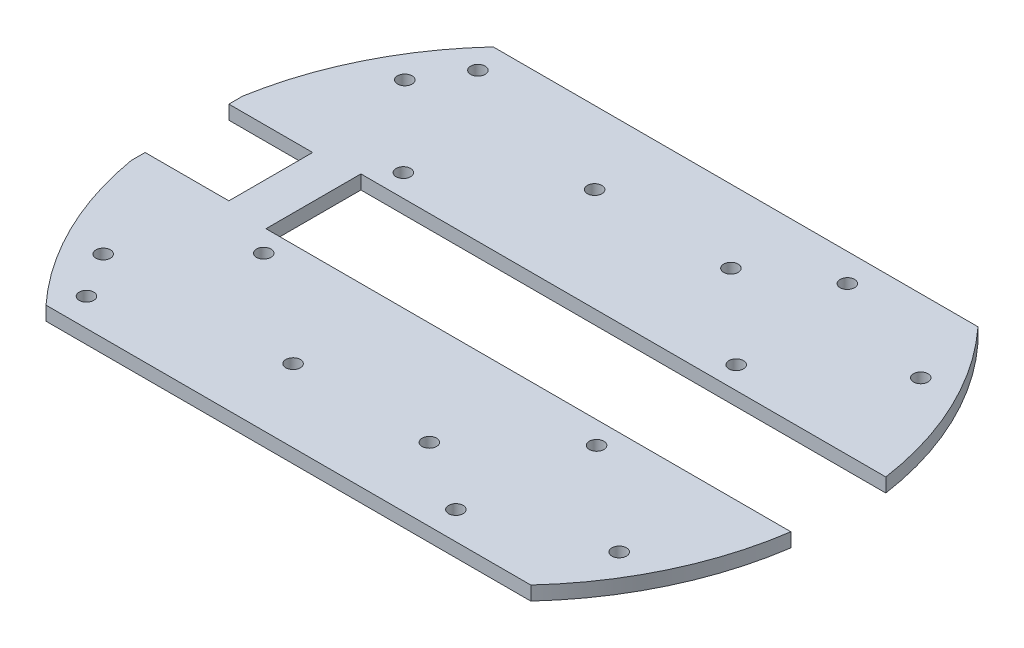
ISO-10303-21;
HEADER;
FILE_DESCRIPTION(('STEP AP214'),'2;1');
FILE_NAME('part.step','',(''),(''),'','','');
FILE_SCHEMA(('AUTOMOTIVE_DESIGN { 1 0 10303 214 1 1 1 1 }'));
ENDSEC;
DATA;
#1=APPLICATION_CONTEXT('core data for automotive mechanical design processes');
#2=APPLICATION_PROTOCOL_DEFINITION('international standard','automotive_design',2000,#1);
#3=PRODUCT_CONTEXT('',#1,'mechanical');
#4=PRODUCT('Part','Part','',(#3));
#5=PRODUCT_RELATED_PRODUCT_CATEGORY('part','',(#4));
#6=PRODUCT_DEFINITION_FORMATION('','',#4);
#7=PRODUCT_DEFINITION_CONTEXT('part definition',#1,'design');
#8=PRODUCT_DEFINITION('design','',#6,#7);
#9=PRODUCT_DEFINITION_SHAPE('','',#8);
#10=(LENGTH_UNIT() NAMED_UNIT(*) SI_UNIT(.MILLI.,.METRE.));
#11=(NAMED_UNIT(*) PLANE_ANGLE_UNIT() SI_UNIT($,.RADIAN.));
#12=(NAMED_UNIT(*) SI_UNIT($,.STERADIAN.) SOLID_ANGLE_UNIT());
#13=UNCERTAINTY_MEASURE_WITH_UNIT(LENGTH_MEASURE(1.E-05),#10,'distance_accuracy_value','');
#14=(GEOMETRIC_REPRESENTATION_CONTEXT(3) GLOBAL_UNCERTAINTY_ASSIGNED_CONTEXT((#13)) GLOBAL_UNIT_ASSIGNED_CONTEXT((#10,
#11,#12)) REPRESENTATION_CONTEXT('',''));
#15=CARTESIAN_POINT('',(0.,0.,0.));
#16=DIRECTION('',(0.,0.,1.));
#17=DIRECTION('',(1.,0.,0.));
#18=AXIS2_PLACEMENT_3D('',#15,#16,#17);
#19=CARTESIAN_POINT('',(-73.9169128143215,3.175,-12.7));
#20=DIRECTION('',(1.,0.,0.));
#21=DIRECTION('',(0.,0.,-1.));
#22=AXIS2_PLACEMENT_3D('',#19,#20,#21);
#23=PLANE('',#22);
#24=DIRECTION('',(0.,0.,1.));
#25=VECTOR('',#24,1.);
#26=CARTESIAN_POINT('',(-73.9169128143215,0.,-12.7));
#27=LINE('',#26,#25);
#28=CARTESIAN_POINT('',(-73.9169128143215,0.,-12.7));
#29=VERTEX_POINT('',#28);
#30=CARTESIAN_POINT('',(-73.9169128143215,0.,-9.525));
#31=VERTEX_POINT('',#30);
#32=EDGE_CURVE('E179',#29,#31,#27,.T.);
#33=ORIENTED_EDGE('',*,*,#32,.T.);
#34=DIRECTION('',(0.,1.,0.));
#35=VECTOR('',#34,1.);
#36=CARTESIAN_POINT('',(-73.9169128143215,-26.9407683632075,-9.525));
#37=LINE('',#36,#35);
#38=CARTESIAN_POINT('',(-73.9169128143215,3.175,-9.525));
#39=VERTEX_POINT('',#38);
#40=EDGE_CURVE('E337',#31,#39,#37,.T.);
#41=ORIENTED_EDGE('',*,*,#40,.T.);
#42=DIRECTION('',(0.,0.,1.));
#43=VECTOR('',#42,1.);
#44=CARTESIAN_POINT('',(-73.9169128143215,3.175,-12.7));
#45=LINE('',#44,#43);
#46=CARTESIAN_POINT('',(-73.9169128143215,3.175,-12.7));
#47=VERTEX_POINT('',#46);
#48=EDGE_CURVE('E155',#47,#39,#45,.T.);
#49=ORIENTED_EDGE('',*,*,#48,.F.);
#50=DIRECTION('',(0.,-1.,0.));
#51=VECTOR('',#50,1.);
#52=CARTESIAN_POINT('',(-73.9169128143215,3.175,-12.7));
#53=LINE('',#52,#51);
#54=EDGE_CURVE('E149',#47,#29,#53,.T.);
#55=ORIENTED_EDGE('',*,*,#54,.T.);
#56=EDGE_LOOP('',(#33,#41,#49,#55));
#57=FACE_BOUND('',#56,.T.);
#58=ADVANCED_FACE('F33',(#57),#23,.F.);
#59=CARTESIAN_POINT('',(0.,3.175,0.));
#60=DIRECTION('',(0.,1.,0.));
#61=DIRECTION('',(0.,0.,1.));
#62=AXIS2_PLACEMENT_3D('',#59,#60,#61);
#63=PLANE('',#62);
#64=DIRECTION('',(-1.,0.,0.));
#65=VECTOR('',#64,1.);
#66=CARTESIAN_POINT('',(-73.9169128143215,3.175,-9.525));
#67=LINE('',#66,#65);
#68=CARTESIAN_POINT('',(-54.8669128143215,3.175,-9.525));
#69=VERTEX_POINT('',#68);
#70=EDGE_CURVE('E331',#69,#39,#67,.T.);
#71=ORIENTED_EDGE('',*,*,#70,.F.);
#72=DIRECTION('',(0.,0.,-1.));
#73=VECTOR('',#72,1.);
#74=CARTESIAN_POINT('',(-54.8669128143215,3.175,-9.525));
#75=LINE('',#74,#73);
#76=CARTESIAN_POINT('',(-54.8669128143215,3.175,9.525));
#77=VERTEX_POINT('',#76);
#78=EDGE_CURVE('E343',#77,#69,#75,.T.);
#79=ORIENTED_EDGE('',*,*,#78,.F.);
#80=DIRECTION('',(1.,0.,0.));
#81=VECTOR('',#80,1.);
#82=CARTESIAN_POINT('',(-54.8669128143215,3.175,9.525));
#83=LINE('',#82,#81);
#84=CARTESIAN_POINT('',(-73.9169128143215,3.175,9.525));
#85=VERTEX_POINT('',#84);
#86=EDGE_CURVE('E346',#85,#77,#83,.T.);
#87=ORIENTED_EDGE('',*,*,#86,.F.);
#88=CARTESIAN_POINT('',(-73.9169128143215,3.175,12.7));
#89=VERTEX_POINT('',#88);
#90=EDGE_CURVE('E57',#85,#89,#45,.T.);
#91=ORIENTED_EDGE('',*,*,#90,.T.);
#92=CARTESIAN_POINT('',(0.,3.175,0.));
#93=DIRECTION('',(0.,1.,0.));
#94=DIRECTION('',(0.,0.,1.));
#95=AXIS2_PLACEMENT_3D('',#92,#93,#94);
#96=CIRCLE('',#95,75.);
#97=CARTESIAN_POINT('',(-55.1227591712517,3.175,50.8574618059944));
#98=VERTEX_POINT('',#97);
#99=EDGE_CURVE('E182',#89,#98,#96,.T.);
#100=ORIENTED_EDGE('',*,*,#99,.T.);
#101=DIRECTION('',(1.,0.,0.));
#102=VECTOR('',#101,1.);
#103=CARTESIAN_POINT('',(-55.1227591712517,3.175,50.8574618059944));
#104=LINE('',#103,#102);
#105=CARTESIAN_POINT('',(55.1227591712517,3.175,50.8574618059944));
#106=VERTEX_POINT('',#105);
#107=EDGE_CURVE('E104',#98,#106,#104,.T.);
#108=ORIENTED_EDGE('',*,*,#107,.T.);
#109=CARTESIAN_POINT('',(0.,3.175,0.));
#110=DIRECTION('',(0.,1.,0.));
#111=DIRECTION('',(0.,0.,1.));
#112=AXIS2_PLACEMENT_3D('',#109,#110,#111);
#113=CIRCLE('',#112,75.);
#114=CARTESIAN_POINT('',(74.2190539888511,3.175,10.795));
#115=VERTEX_POINT('',#114);
#116=EDGE_CURVE('E203',#106,#115,#113,.T.);
#117=ORIENTED_EDGE('',*,*,#116,.T.);
#118=DIRECTION('',(-1.,0.,0.));
#119=VECTOR('',#118,1.);
#120=CARTESIAN_POINT('',(74.2190539888511,3.175,10.795));
#121=LINE('',#120,#119);
#122=CARTESIAN_POINT('',(-45.1587340920467,3.175,10.795));
#123=VERTEX_POINT('',#122);
#124=EDGE_CURVE('E223',#115,#123,#121,.T.);
#125=ORIENTED_EDGE('',*,*,#124,.T.);
#126=DIRECTION('',(0.,0.,-1.));
#127=VECTOR('',#126,1.);
#128=CARTESIAN_POINT('',(-45.1587340920467,3.175,-10.795));
#129=LINE('',#128,#127);
#130=CARTESIAN_POINT('',(-45.1587340920467,3.175,-10.795));
#131=VERTEX_POINT('',#130);
#132=EDGE_CURVE('E220',#123,#131,#129,.T.);
#133=ORIENTED_EDGE('',*,*,#132,.T.);
#134=DIRECTION('',(1.,0.,0.));
#135=VECTOR('',#134,1.);
#136=CARTESIAN_POINT('',(74.2190539888511,3.175,-10.795));
#137=LINE('',#136,#135);
#138=CARTESIAN_POINT('',(74.2190539888511,3.175,-10.795));
#139=VERTEX_POINT('',#138);
#140=EDGE_CURVE('E222',#131,#139,#137,.T.);
#141=ORIENTED_EDGE('',*,*,#140,.T.);
#142=CARTESIAN_POINT('',(0.,3.175,0.));
#143=DIRECTION('',(0.,1.,0.));
#144=DIRECTION('',(0.,0.,1.));
#145=AXIS2_PLACEMENT_3D('',#142,#143,#144);
#146=CIRCLE('',#145,75.);
#147=CARTESIAN_POINT('',(55.1227591712517,3.175,-50.8574618059944));
#148=VERTEX_POINT('',#147);
#149=EDGE_CURVE('E136',#139,#148,#146,.T.);
#150=ORIENTED_EDGE('',*,*,#149,.T.);
#151=DIRECTION('',(-1.,0.,0.));
#152=VECTOR('',#151,1.);
#153=CARTESIAN_POINT('',(-55.1227591712517,3.175,-50.8574618059944));
#154=LINE('',#153,#152);
#155=CARTESIAN_POINT('',(-55.1227591712517,3.175,-50.8574618059944));
#156=VERTEX_POINT('',#155);
#157=EDGE_CURVE('E126',#148,#156,#154,.T.);
#158=ORIENTED_EDGE('',*,*,#157,.T.);
#159=CARTESIAN_POINT('',(0.,3.175,0.));
#160=DIRECTION('',(0.,1.,0.));
#161=DIRECTION('',(0.,0.,1.));
#162=AXIS2_PLACEMENT_3D('',#159,#160,#161);
#163=CIRCLE('',#162,75.);
#164=EDGE_CURVE('E133',#156,#47,#163,.T.);
#165=ORIENTED_EDGE('',*,*,#164,.T.);
#166=ORIENTED_EDGE('',*,*,#48,.T.);
#167=EDGE_LOOP('',(#71,#79,#87,#91,#100,#108,#117,#125,#133,#141,#150,#158,#165,#166));
#168=FACE_BOUND('',#167,.T.);
#169=CARTESIAN_POINT('',(58.6769128143214,3.175,-34.2899999999999));
#170=DIRECTION('',(0.,1.,0.));
#171=DIRECTION('',(0.,0.,-1.));
#172=AXIS2_PLACEMENT_3D('',#169,#170,#171);
#173=CIRCLE('',#172,1.651);
#174=CARTESIAN_POINT('',(58.6769128143214,3.175,-35.9409999999999));
#175=VERTEX_POINT('',#174);
#176=EDGE_CURVE('E312',#175,#175,#173,.T.);
#177=ORIENTED_EDGE('',*,*,#176,.F.);
#178=EDGE_LOOP('',(#177));
#179=FACE_BOUND('',#178,.T.);
#180=CARTESIAN_POINT('',(15.4969128143214,3.175,34.2899999999999));
#181=DIRECTION('',(0.,1.,0.));
#182=DIRECTION('',(0.,0.,-1.));
#183=AXIS2_PLACEMENT_3D('',#180,#181,#182);
#184=CIRCLE('',#183,1.651);
#185=CARTESIAN_POINT('',(15.4969128143214,3.175,32.6389999999999));
#186=VERTEX_POINT('',#185);
#187=EDGE_CURVE('E300',#186,#186,#184,.T.);
#188=ORIENTED_EDGE('',*,*,#187,.F.);
#189=EDGE_LOOP('',(#188));
#190=FACE_BOUND('',#189,.T.);
#191=CARTESIAN_POINT('',(-15.4969128143214,3.175,34.29));
#192=DIRECTION('',(0.,1.,0.));
#193=DIRECTION('',(0.,0.,1.));
#194=AXIS2_PLACEMENT_3D('',#191,#192,#193);
#195=CIRCLE('',#194,1.651);
#196=CARTESIAN_POINT('',(-15.4969128143214,3.175,35.941));
#197=VERTEX_POINT('',#196);
#198=EDGE_CURVE('E288',#197,#197,#195,.T.);
#199=ORIENTED_EDGE('',*,*,#198,.F.);
#200=EDGE_LOOP('',(#199));
#201=FACE_BOUND('',#200,.T.);
#202=CARTESIAN_POINT('',(-58.6769128143214,3.175,-34.2899999999999));
#203=DIRECTION('',(0.,1.,0.));
#204=DIRECTION('',(0.,0.,1.));
#205=AXIS2_PLACEMENT_3D('',#202,#203,#204);
#206=CIRCLE('',#205,1.651);
#207=CARTESIAN_POINT('',(-58.6769128143214,3.175,-32.6389999999999));
#208=VERTEX_POINT('',#207);
#209=EDGE_CURVE('E276',#208,#208,#206,.T.);
#210=ORIENTED_EDGE('',*,*,#209,.F.);
#211=EDGE_LOOP('',(#210));
#212=FACE_BOUND('',#211,.T.);
#213=CARTESIAN_POINT('',(-52.2676605903492,3.175,44.5074618059944));
#214=DIRECTION('',(0.,1.,0.));
#215=DIRECTION('',(0.,0.,1.));
#216=AXIS2_PLACEMENT_3D('',#213,#214,#215);
#217=CIRCLE('',#216,1.651);
#218=CARTESIAN_POINT('',(-52.2676605903492,3.175,46.1584618059944));
#219=VERTEX_POINT('',#218);
#220=EDGE_CURVE('E264',#219,#219,#217,.T.);
#221=ORIENTED_EDGE('',*,*,#220,.F.);
#222=EDGE_LOOP('',(#221));
#223=FACE_BOUND('',#222,.T.);
#224=CARTESIAN_POINT('',(31.75,3.175,-44.5074618059944));
#225=DIRECTION('',(0.,1.,0.));
#226=DIRECTION('',(0.,0.,1.));
#227=AXIS2_PLACEMENT_3D('',#224,#225,#226);
#228=CIRCLE('',#227,1.651);
#229=CARTESIAN_POINT('',(31.75,3.175,-42.8564618059944));
#230=VERTEX_POINT('',#229);
#231=EDGE_CURVE('E252',#230,#230,#228,.T.);
#232=ORIENTED_EDGE('',*,*,#231,.F.);
#233=EDGE_LOOP('',(#232));
#234=FACE_BOUND('',#233,.T.);
#235=CARTESIAN_POINT('',(-40.5944268326438,3.175,15.875));
#236=DIRECTION('',(0.,1.,0.));
#237=DIRECTION('',(0.,0.,1.));
#238=AXIS2_PLACEMENT_3D('',#235,#236,#237);
#239=CIRCLE('',#238,1.65099999999997);
#240=CARTESIAN_POINT('',(-40.5944268326438,3.175,17.526));
#241=VERTEX_POINT('',#240);
#242=EDGE_CURVE('E240',#241,#241,#239,.T.);
#243=ORIENTED_EDGE('',*,*,#242,.F.);
#244=EDGE_LOOP('',(#243));
#245=FACE_BOUND('',#244,.T.);
#246=CARTESIAN_POINT('',(35.1052659079533,3.175,-15.875));
#247=DIRECTION('',(0.,1.,0.));
#248=DIRECTION('',(0.,0.,1.));
#249=AXIS2_PLACEMENT_3D('',#246,#247,#248);
#250=CIRCLE('',#249,1.65099999999997);
#251=CARTESIAN_POINT('',(35.1052659079533,3.175,-14.224));
#252=VERTEX_POINT('',#251);
#253=EDGE_CURVE('E164',#252,#252,#250,.T.);
#254=ORIENTED_EDGE('',*,*,#253,.F.);
#255=EDGE_LOOP('',(#254));
#256=FACE_BOUND('',#255,.T.);
#257=CARTESIAN_POINT('',(35.1052659079533,3.175,15.875));
#258=DIRECTION('',(0.,1.,0.));
#259=DIRECTION('',(0.,0.,1.));
#260=AXIS2_PLACEMENT_3D('',#257,#258,#259);
#261=CIRCLE('',#260,1.65099999999997);
#262=CARTESIAN_POINT('',(35.1052659079533,3.175,17.526));
#263=VERTEX_POINT('',#262);
#264=EDGE_CURVE('E234',#263,#263,#261,.T.);
#265=ORIENTED_EDGE('',*,*,#264,.F.);
#266=EDGE_LOOP('',(#265));
#267=FACE_BOUND('',#266,.T.);
#268=CARTESIAN_POINT('',(-40.5944268326438,3.175,-15.875));
#269=DIRECTION('',(0.,1.,0.));
#270=DIRECTION('',(0.,0.,1.));
#271=AXIS2_PLACEMENT_3D('',#268,#269,#270);
#272=CIRCLE('',#271,1.65099999999997);
#273=CARTESIAN_POINT('',(-40.5944268326438,3.175,-14.224));
#274=VERTEX_POINT('',#273);
#275=EDGE_CURVE('E246',#274,#274,#272,.T.);
#276=ORIENTED_EDGE('',*,*,#275,.F.);
#277=EDGE_LOOP('',(#276));
#278=FACE_BOUND('',#277,.T.);
#279=CARTESIAN_POINT('',(31.75,3.175,44.5074618059944));
#280=DIRECTION('',(0.,1.,0.));
#281=DIRECTION('',(0.,0.,1.));
#282=AXIS2_PLACEMENT_3D('',#279,#280,#281);
#283=CIRCLE('',#282,1.651);
#284=CARTESIAN_POINT('',(31.75,3.175,46.1584618059944));
#285=VERTEX_POINT('',#284);
#286=EDGE_CURVE('E258',#285,#285,#283,.T.);
#287=ORIENTED_EDGE('',*,*,#286,.F.);
#288=EDGE_LOOP('',(#287));
#289=FACE_BOUND('',#288,.T.);
#290=CARTESIAN_POINT('',(-52.2676605903492,3.175,-44.5074618059944));
#291=DIRECTION('',(0.,1.,0.));
#292=DIRECTION('',(0.,0.,1.));
#293=AXIS2_PLACEMENT_3D('',#290,#291,#292);
#294=CIRCLE('',#293,1.651);
#295=CARTESIAN_POINT('',(-52.2676605903492,3.175,-42.8564618059944));
#296=VERTEX_POINT('',#295);
#297=EDGE_CURVE('E270',#296,#296,#294,.T.);
#298=ORIENTED_EDGE('',*,*,#297,.F.);
#299=EDGE_LOOP('',(#298));
#300=FACE_BOUND('',#299,.T.);
#301=CARTESIAN_POINT('',(-15.4969128143214,3.175,-34.2899999999999));
#302=DIRECTION('',(0.,1.,0.));
#303=DIRECTION('',(0.,0.,1.));
#304=AXIS2_PLACEMENT_3D('',#301,#302,#303);
#305=CIRCLE('',#304,1.651);
#306=CARTESIAN_POINT('',(-15.4969128143214,3.175,-32.6389999999999));
#307=VERTEX_POINT('',#306);
#308=EDGE_CURVE('E282',#307,#307,#305,.T.);
#309=ORIENTED_EDGE('',*,*,#308,.F.);
#310=EDGE_LOOP('',(#309));
#311=FACE_BOUND('',#310,.T.);
#312=CARTESIAN_POINT('',(-58.6769128143214,3.175,34.29));
#313=DIRECTION('',(0.,1.,0.));
#314=DIRECTION('',(0.,0.,1.));
#315=AXIS2_PLACEMENT_3D('',#312,#313,#314);
#316=CIRCLE('',#315,1.651);
#317=CARTESIAN_POINT('',(-58.6769128143214,3.175,35.941));
#318=VERTEX_POINT('',#317);
#319=EDGE_CURVE('E294',#318,#318,#316,.T.);
#320=ORIENTED_EDGE('',*,*,#319,.F.);
#321=EDGE_LOOP('',(#320));
#322=FACE_BOUND('',#321,.T.);
#323=CARTESIAN_POINT('',(58.6769128143214,3.175,34.2899999999999));
#324=DIRECTION('',(0.,1.,0.));
#325=DIRECTION('',(0.,0.,-1.));
#326=AXIS2_PLACEMENT_3D('',#323,#324,#325);
#327=CIRCLE('',#326,1.651);
#328=CARTESIAN_POINT('',(58.6769128143214,3.175,32.6389999999999));
#329=VERTEX_POINT('',#328);
#330=EDGE_CURVE('E306',#329,#329,#327,.T.);
#331=ORIENTED_EDGE('',*,*,#330,.F.);
#332=EDGE_LOOP('',(#331));
#333=FACE_BOUND('',#332,.T.);
#334=CARTESIAN_POINT('',(15.4969128143214,3.175,-34.2899999999999));
#335=DIRECTION('',(0.,1.,0.));
#336=DIRECTION('',(0.,0.,-1.));
#337=AXIS2_PLACEMENT_3D('',#334,#335,#336);
#338=CIRCLE('',#337,1.651);
#339=CARTESIAN_POINT('',(15.4969128143214,3.175,-35.941));
#340=VERTEX_POINT('',#339);
#341=EDGE_CURVE('E318',#340,#340,#338,.T.);
#342=ORIENTED_EDGE('',*,*,#341,.F.);
#343=EDGE_LOOP('',(#342));
#344=FACE_BOUND('',#343,.T.);
#345=ADVANCED_FACE('F129',(#168,#179,#190,#201,#212,#223,#234,#245,#256,#267,#278,#289,#300,
#311,#322,#333,#344),#63,.T.);
#346=CARTESIAN_POINT('',(0.,0.,0.));
#347=DIRECTION('',(0.,1.,0.));
#348=DIRECTION('',(0.,0.,1.));
#349=AXIS2_PLACEMENT_3D('',#346,#347,#348);
#350=PLANE('',#349);
#351=CARTESIAN_POINT('',(58.6769128143214,0.,-34.2899999999999));
#352=DIRECTION('',(0.,1.,0.));
#353=DIRECTION('',(0.,0.,-1.));
#354=AXIS2_PLACEMENT_3D('',#351,#352,#353);
#355=CIRCLE('',#354,1.651);
#356=CARTESIAN_POINT('',(58.6769128143214,0.,-35.9409999999999));
#357=VERTEX_POINT('',#356);
#358=EDGE_CURVE('E315',#357,#357,#355,.T.);
#359=ORIENTED_EDGE('',*,*,#358,.T.);
#360=EDGE_LOOP('',(#359));
#361=FACE_BOUND('',#360,.T.);
#362=CARTESIAN_POINT('',(15.4969128143214,0.,34.2899999999999));
#363=DIRECTION('',(0.,1.,0.));
#364=DIRECTION('',(0.,0.,-1.));
#365=AXIS2_PLACEMENT_3D('',#362,#363,#364);
#366=CIRCLE('',#365,1.651);
#367=CARTESIAN_POINT('',(15.4969128143214,0.,32.6389999999999));
#368=VERTEX_POINT('',#367);
#369=EDGE_CURVE('E303',#368,#368,#366,.T.);
#370=ORIENTED_EDGE('',*,*,#369,.T.);
#371=EDGE_LOOP('',(#370));
#372=FACE_BOUND('',#371,.T.);
#373=CARTESIAN_POINT('',(-15.4969128143214,0.,34.29));
#374=DIRECTION('',(0.,1.,0.));
#375=DIRECTION('',(0.,0.,1.));
#376=AXIS2_PLACEMENT_3D('',#373,#374,#375);
#377=CIRCLE('',#376,1.651);
#378=CARTESIAN_POINT('',(-15.4969128143214,0.,35.941));
#379=VERTEX_POINT('',#378);
#380=EDGE_CURVE('E291',#379,#379,#377,.T.);
#381=ORIENTED_EDGE('',*,*,#380,.T.);
#382=EDGE_LOOP('',(#381));
#383=FACE_BOUND('',#382,.T.);
#384=CARTESIAN_POINT('',(-58.6769128143214,0.,-34.2899999999999));
#385=DIRECTION('',(0.,1.,0.));
#386=DIRECTION('',(0.,0.,1.));
#387=AXIS2_PLACEMENT_3D('',#384,#385,#386);
#388=CIRCLE('',#387,1.651);
#389=CARTESIAN_POINT('',(-58.6769128143214,0.,-32.6389999999999));
#390=VERTEX_POINT('',#389);
#391=EDGE_CURVE('E279',#390,#390,#388,.T.);
#392=ORIENTED_EDGE('',*,*,#391,.T.);
#393=EDGE_LOOP('',(#392));
#394=FACE_BOUND('',#393,.T.);
#395=CARTESIAN_POINT('',(-52.2676605903492,0.,44.5074618059944));
#396=DIRECTION('',(0.,1.,0.));
#397=DIRECTION('',(0.,0.,1.));
#398=AXIS2_PLACEMENT_3D('',#395,#396,#397);
#399=CIRCLE('',#398,1.651);
#400=CARTESIAN_POINT('',(-52.2676605903492,0.,46.1584618059944));
#401=VERTEX_POINT('',#400);
#402=EDGE_CURVE('E267',#401,#401,#399,.T.);
#403=ORIENTED_EDGE('',*,*,#402,.T.);
#404=EDGE_LOOP('',(#403));
#405=FACE_BOUND('',#404,.T.);
#406=CARTESIAN_POINT('',(31.75,0.,-44.5074618059944));
#407=DIRECTION('',(0.,1.,0.));
#408=DIRECTION('',(0.,0.,1.));
#409=AXIS2_PLACEMENT_3D('',#406,#407,#408);
#410=CIRCLE('',#409,1.651);
#411=CARTESIAN_POINT('',(31.75,0.,-42.8564618059944));
#412=VERTEX_POINT('',#411);
#413=EDGE_CURVE('E255',#412,#412,#410,.T.);
#414=ORIENTED_EDGE('',*,*,#413,.T.);
#415=EDGE_LOOP('',(#414));
#416=FACE_BOUND('',#415,.T.);
#417=CARTESIAN_POINT('',(-40.5944268326438,0.,15.875));
#418=DIRECTION('',(0.,1.,0.));
#419=DIRECTION('',(0.,0.,1.));
#420=AXIS2_PLACEMENT_3D('',#417,#418,#419);
#421=CIRCLE('',#420,1.65099999999997);
#422=CARTESIAN_POINT('',(-40.5944268326438,0.,17.526));
#423=VERTEX_POINT('',#422);
#424=EDGE_CURVE('E243',#423,#423,#421,.T.);
#425=ORIENTED_EDGE('',*,*,#424,.T.);
#426=EDGE_LOOP('',(#425));
#427=FACE_BOUND('',#426,.T.);
#428=CARTESIAN_POINT('',(35.1052659079533,0.,-15.875));
#429=DIRECTION('',(0.,1.,0.));
#430=DIRECTION('',(0.,0.,1.));
#431=AXIS2_PLACEMENT_3D('',#428,#429,#430);
#432=CIRCLE('',#431,1.65099999999997);
#433=CARTESIAN_POINT('',(35.1052659079533,0.,-14.224));
#434=VERTEX_POINT('',#433);
#435=EDGE_CURVE('E231',#434,#434,#432,.T.);
#436=ORIENTED_EDGE('',*,*,#435,.T.);
#437=EDGE_LOOP('',(#436));
#438=FACE_BOUND('',#437,.T.);
#439=DIRECTION('',(0.,0.,1.));
#440=VECTOR('',#439,1.);
#441=CARTESIAN_POINT('',(-54.8669128143215,0.,-9.525));
#442=LINE('',#441,#440);
#443=CARTESIAN_POINT('',(-54.8669128143215,0.,-9.525));
#444=VERTEX_POINT('',#443);
#445=CARTESIAN_POINT('',(-54.8669128143215,0.,9.525));
#446=VERTEX_POINT('',#445);
#447=EDGE_CURVE('E340',#444,#446,#442,.T.);
#448=ORIENTED_EDGE('',*,*,#447,.F.);
#449=DIRECTION('',(1.,0.,0.));
#450=VECTOR('',#449,1.);
#451=CARTESIAN_POINT('',(-73.9169128143215,0.,-9.525));
#452=LINE('',#451,#450);
#453=EDGE_CURVE('E327',#31,#444,#452,.T.);
#454=ORIENTED_EDGE('',*,*,#453,.F.);
#455=ORIENTED_EDGE('',*,*,#32,.F.);
#456=CARTESIAN_POINT('',(0.,0.,0.));
#457=DIRECTION('',(0.,1.,0.));
#458=DIRECTION('',(0.,0.,1.));
#459=AXIS2_PLACEMENT_3D('',#456,#457,#458);
#460=CIRCLE('',#459,75.);
#461=CARTESIAN_POINT('',(-55.1227591712517,0.,-50.8574618059944));
#462=VERTEX_POINT('',#461);
#463=EDGE_CURVE('E177',#462,#29,#460,.T.);
#464=ORIENTED_EDGE('',*,*,#463,.F.);
#465=DIRECTION('',(-1.,0.,0.));
#466=VECTOR('',#465,1.);
#467=CARTESIAN_POINT('',(-55.1227591712517,0.,-50.8574618059944));
#468=LINE('',#467,#466);
#469=CARTESIAN_POINT('',(55.1227591712517,0.,-50.8574618059944));
#470=VERTEX_POINT('',#469);
#471=EDGE_CURVE('E145',#470,#462,#468,.T.);
#472=ORIENTED_EDGE('',*,*,#471,.F.);
#473=CARTESIAN_POINT('',(0.,0.,0.));
#474=DIRECTION('',(0.,1.,0.));
#475=DIRECTION('',(0.,0.,1.));
#476=AXIS2_PLACEMENT_3D('',#473,#474,#475);
#477=CIRCLE('',#476,75.);
#478=CARTESIAN_POINT('',(74.2190539888511,0.,-10.795));
#479=VERTEX_POINT('',#478);
#480=EDGE_CURVE('E174',#479,#470,#477,.T.);
#481=ORIENTED_EDGE('',*,*,#480,.F.);
#482=DIRECTION('',(1.,0.,0.));
#483=VECTOR('',#482,1.);
#484=CARTESIAN_POINT('',(74.2190539888511,0.,-10.795));
#485=LINE('',#484,#483);
#486=CARTESIAN_POINT('',(-45.1587340920467,0.,-10.795));
#487=VERTEX_POINT('',#486);
#488=EDGE_CURVE('E172',#487,#479,#485,.T.);
#489=ORIENTED_EDGE('',*,*,#488,.F.);
#490=DIRECTION('',(0.,0.,-1.));
#491=VECTOR('',#490,1.);
#492=CARTESIAN_POINT('',(-45.1587340920467,0.,-10.795));
#493=LINE('',#492,#491);
#494=CARTESIAN_POINT('',(-45.1587340920467,0.,10.795));
#495=VERTEX_POINT('',#494);
#496=EDGE_CURVE('E170',#495,#487,#493,.T.);
#497=ORIENTED_EDGE('',*,*,#496,.F.);
#498=DIRECTION('',(-1.,0.,0.));
#499=VECTOR('',#498,1.);
#500=CARTESIAN_POINT('',(74.2190539888511,0.,10.795));
#501=LINE('',#500,#499);
#502=CARTESIAN_POINT('',(74.2190539888511,0.,10.795));
#503=VERTEX_POINT('',#502);
#504=EDGE_CURVE('E168',#503,#495,#501,.T.);
#505=ORIENTED_EDGE('',*,*,#504,.F.);
#506=CARTESIAN_POINT('',(0.,0.,0.));
#507=DIRECTION('',(0.,1.,0.));
#508=DIRECTION('',(0.,0.,1.));
#509=AXIS2_PLACEMENT_3D('',#506,#507,#508);
#510=CIRCLE('',#509,75.);
#511=CARTESIAN_POINT('',(55.1227591712517,0.,50.8574618059944));
#512=VERTEX_POINT('',#511);
#513=EDGE_CURVE('E166',#512,#503,#510,.T.);
#514=ORIENTED_EDGE('',*,*,#513,.F.);
#515=DIRECTION('',(1.,0.,0.));
#516=VECTOR('',#515,1.);
#517=CARTESIAN_POINT('',(-55.1227591712517,0.,50.8574618059944));
#518=LINE('',#517,#516);
#519=CARTESIAN_POINT('',(-55.1227591712517,0.,50.8574618059944));
#520=VERTEX_POINT('',#519);
#521=EDGE_CURVE('E163',#520,#512,#518,.T.);
#522=ORIENTED_EDGE('',*,*,#521,.F.);
#523=CARTESIAN_POINT('',(0.,0.,0.));
#524=DIRECTION('',(0.,1.,0.));
#525=DIRECTION('',(0.,0.,1.));
#526=AXIS2_PLACEMENT_3D('',#523,#524,#525);
#527=CIRCLE('',#526,75.);
#528=CARTESIAN_POINT('',(-73.9169128143215,0.,12.7));
#529=VERTEX_POINT('',#528);
#530=EDGE_CURVE('E160',#529,#520,#527,.T.);
#531=ORIENTED_EDGE('',*,*,#530,.F.);
#532=CARTESIAN_POINT('',(-73.9169128143215,0.,9.525));
#533=VERTEX_POINT('',#532);
#534=EDGE_CURVE('E96',#533,#529,#27,.T.);
#535=ORIENTED_EDGE('',*,*,#534,.F.);
#536=DIRECTION('',(-1.,0.,0.));
#537=VECTOR('',#536,1.);
#538=CARTESIAN_POINT('',(-54.8669128143215,0.,9.525));
#539=LINE('',#538,#537);
#540=EDGE_CURVE('E48',#446,#533,#539,.T.);
#541=ORIENTED_EDGE('',*,*,#540,.F.);
#542=EDGE_LOOP('',(#448,#454,#455,#464,#472,#481,#489,#497,#505,#514,#522,#531,#535,#541));
#543=FACE_BOUND('',#542,.T.);
#544=CARTESIAN_POINT('',(35.1052659079533,0.,15.875));
#545=DIRECTION('',(0.,1.,0.));
#546=DIRECTION('',(0.,0.,1.));
#547=AXIS2_PLACEMENT_3D('',#544,#545,#546);
#548=CIRCLE('',#547,1.65099999999997);
#549=CARTESIAN_POINT('',(35.1052659079533,0.,17.526));
#550=VERTEX_POINT('',#549);
#551=EDGE_CURVE('E237',#550,#550,#548,.T.);
#552=ORIENTED_EDGE('',*,*,#551,.T.);
#553=EDGE_LOOP('',(#552));
#554=FACE_BOUND('',#553,.T.);
#555=CARTESIAN_POINT('',(-40.5944268326438,0.,-15.875));
#556=DIRECTION('',(0.,1.,0.));
#557=DIRECTION('',(0.,0.,1.));
#558=AXIS2_PLACEMENT_3D('',#555,#556,#557);
#559=CIRCLE('',#558,1.65099999999997);
#560=CARTESIAN_POINT('',(-40.5944268326438,0.,-14.224));
#561=VERTEX_POINT('',#560);
#562=EDGE_CURVE('E249',#561,#561,#559,.T.);
#563=ORIENTED_EDGE('',*,*,#562,.T.);
#564=EDGE_LOOP('',(#563));
#565=FACE_BOUND('',#564,.T.);
#566=CARTESIAN_POINT('',(31.75,0.,44.5074618059944));
#567=DIRECTION('',(0.,1.,0.));
#568=DIRECTION('',(0.,0.,1.));
#569=AXIS2_PLACEMENT_3D('',#566,#567,#568);
#570=CIRCLE('',#569,1.651);
#571=CARTESIAN_POINT('',(31.75,0.,46.1584618059944));
#572=VERTEX_POINT('',#571);
#573=EDGE_CURVE('E261',#572,#572,#570,.T.);
#574=ORIENTED_EDGE('',*,*,#573,.T.);
#575=EDGE_LOOP('',(#574));
#576=FACE_BOUND('',#575,.T.);
#577=CARTESIAN_POINT('',(-52.2676605903492,0.,-44.5074618059944));
#578=DIRECTION('',(0.,1.,0.));
#579=DIRECTION('',(0.,0.,1.));
#580=AXIS2_PLACEMENT_3D('',#577,#578,#579);
#581=CIRCLE('',#580,1.651);
#582=CARTESIAN_POINT('',(-52.2676605903492,0.,-42.8564618059944));
#583=VERTEX_POINT('',#582);
#584=EDGE_CURVE('E273',#583,#583,#581,.T.);
#585=ORIENTED_EDGE('',*,*,#584,.T.);
#586=EDGE_LOOP('',(#585));
#587=FACE_BOUND('',#586,.T.);
#588=CARTESIAN_POINT('',(-15.4969128143214,0.,-34.2899999999999));
#589=DIRECTION('',(0.,1.,0.));
#590=DIRECTION('',(0.,0.,1.));
#591=AXIS2_PLACEMENT_3D('',#588,#589,#590);
#592=CIRCLE('',#591,1.651);
#593=CARTESIAN_POINT('',(-15.4969128143214,0.,-32.6389999999999));
#594=VERTEX_POINT('',#593);
#595=EDGE_CURVE('E285',#594,#594,#592,.T.);
#596=ORIENTED_EDGE('',*,*,#595,.T.);
#597=EDGE_LOOP('',(#596));
#598=FACE_BOUND('',#597,.T.);
#599=CARTESIAN_POINT('',(-58.6769128143214,0.,34.29));
#600=DIRECTION('',(0.,1.,0.));
#601=DIRECTION('',(0.,0.,1.));
#602=AXIS2_PLACEMENT_3D('',#599,#600,#601);
#603=CIRCLE('',#602,1.651);
#604=CARTESIAN_POINT('',(-58.6769128143214,0.,35.941));
#605=VERTEX_POINT('',#604);
#606=EDGE_CURVE('E297',#605,#605,#603,.T.);
#607=ORIENTED_EDGE('',*,*,#606,.T.);
#608=EDGE_LOOP('',(#607));
#609=FACE_BOUND('',#608,.T.);
#610=CARTESIAN_POINT('',(58.6769128143214,0.,34.2899999999999));
#611=DIRECTION('',(0.,1.,0.));
#612=DIRECTION('',(0.,0.,-1.));
#613=AXIS2_PLACEMENT_3D('',#610,#611,#612);
#614=CIRCLE('',#613,1.651);
#615=CARTESIAN_POINT('',(58.6769128143214,0.,32.6389999999999));
#616=VERTEX_POINT('',#615);
#617=EDGE_CURVE('E309',#616,#616,#614,.T.);
#618=ORIENTED_EDGE('',*,*,#617,.T.);
#619=EDGE_LOOP('',(#618));
#620=FACE_BOUND('',#619,.T.);
#621=CARTESIAN_POINT('',(15.4969128143214,0.,-34.2899999999999));
#622=DIRECTION('',(0.,1.,0.));
#623=DIRECTION('',(0.,0.,-1.));
#624=AXIS2_PLACEMENT_3D('',#621,#622,#623);
#625=CIRCLE('',#624,1.651);
#626=CARTESIAN_POINT('',(15.4969128143214,0.,-35.941));
#627=VERTEX_POINT('',#626);
#628=EDGE_CURVE('E321',#627,#627,#625,.T.);
#629=ORIENTED_EDGE('',*,*,#628,.T.);
#630=EDGE_LOOP('',(#629));
#631=FACE_BOUND('',#630,.T.);
#632=ADVANCED_FACE('F207',(#361,#372,#383,#394,#405,#416,#427,#438,#543,#554,#565,#576,#587,
#598,#609,#620,#631),#350,.F.);
#633=CARTESIAN_POINT('',(0.,3.175,0.));
#634=DIRECTION('',(0.,-1.,0.));
#635=DIRECTION('',(0.,0.,-1.));
#636=AXIS2_PLACEMENT_3D('',#633,#634,#635);
#637=CYLINDRICAL_SURFACE('',#636,75.);
#638=ORIENTED_EDGE('',*,*,#530,.T.);
#639=DIRECTION('',(0.,-1.,0.));
#640=VECTOR('',#639,1.);
#641=CARTESIAN_POINT('',(-55.1227591712517,3.175,50.8574618059944));
#642=LINE('',#641,#640);
#643=EDGE_CURVE('E11',#98,#520,#642,.T.);
#644=ORIENTED_EDGE('',*,*,#643,.F.);
#645=ORIENTED_EDGE('',*,*,#99,.F.);
#646=DIRECTION('',(0.,-1.,0.));
#647=VECTOR('',#646,1.);
#648=CARTESIAN_POINT('',(-73.9169128143215,3.175,12.7));
#649=LINE('',#648,#647);
#650=EDGE_CURVE('E159',#89,#529,#649,.T.);
#651=ORIENTED_EDGE('',*,*,#650,.T.);
#652=EDGE_LOOP('',(#638,#644,#645,#651));
#653=FACE_BOUND('',#652,.T.);
#654=ADVANCED_FACE('F35',(#653),#637,.T.);
#655=CARTESIAN_POINT('',(-55.1227591712517,3.175,50.8574618059944));
#656=DIRECTION('',(0.,0.,-1.));
#657=DIRECTION('',(-1.,0.,0.));
#658=AXIS2_PLACEMENT_3D('',#655,#656,#657);
#659=PLANE('',#658);
#660=ORIENTED_EDGE('',*,*,#521,.T.);
#661=DIRECTION('',(0.,-1.,0.));
#662=VECTOR('',#661,1.);
#663=CARTESIAN_POINT('',(55.1227591712517,3.175,50.8574618059944));
#664=LINE('',#663,#662);
#665=EDGE_CURVE('E41',#106,#512,#664,.T.);
#666=ORIENTED_EDGE('',*,*,#665,.F.);
#667=ORIENTED_EDGE('',*,*,#107,.F.);
#668=ORIENTED_EDGE('',*,*,#643,.T.);
#669=EDGE_LOOP('',(#660,#666,#667,#668));
#670=FACE_BOUND('',#669,.T.);
#671=ADVANCED_FACE('F412',(#670),#659,.F.);
#672=CARTESIAN_POINT('',(0.,3.175,0.));
#673=DIRECTION('',(0.,-1.,0.));
#674=DIRECTION('',(0.,0.,-1.));
#675=AXIS2_PLACEMENT_3D('',#672,#673,#674);
#676=CYLINDRICAL_SURFACE('',#675,75.);
#677=ORIENTED_EDGE('',*,*,#513,.T.);
#678=DIRECTION('',(0.,-1.,0.));
#679=VECTOR('',#678,1.);
#680=CARTESIAN_POINT('',(74.2190539888511,3.175,10.795));
#681=LINE('',#680,#679);
#682=EDGE_CURVE('E195',#115,#503,#681,.T.);
#683=ORIENTED_EDGE('',*,*,#682,.F.);
#684=ORIENTED_EDGE('',*,*,#116,.F.);
#685=ORIENTED_EDGE('',*,*,#665,.T.);
#686=EDGE_LOOP('',(#677,#683,#684,#685));
#687=FACE_BOUND('',#686,.T.);
#688=ADVANCED_FACE('F201',(#687),#676,.T.);
#689=CARTESIAN_POINT('',(74.2190539888511,3.175,10.795));
#690=DIRECTION('',(0.,0.,1.));
#691=DIRECTION('',(1.,0.,0.));
#692=AXIS2_PLACEMENT_3D('',#689,#690,#691);
#693=PLANE('',#692);
#694=ORIENTED_EDGE('',*,*,#504,.T.);
#695=DIRECTION('',(0.,-1.,0.));
#696=VECTOR('',#695,1.);
#697=CARTESIAN_POINT('',(-45.1587340920467,3.175,10.795));
#698=LINE('',#697,#696);
#699=EDGE_CURVE('E192',#123,#495,#698,.T.);
#700=ORIENTED_EDGE('',*,*,#699,.F.);
#701=ORIENTED_EDGE('',*,*,#124,.F.);
#702=ORIENTED_EDGE('',*,*,#682,.T.);
#703=EDGE_LOOP('',(#694,#700,#701,#702));
#704=FACE_BOUND('',#703,.T.);
#705=ADVANCED_FACE('F214',(#704),#693,.F.);
#706=CARTESIAN_POINT('',(-45.1587340920467,3.175,-10.795));
#707=DIRECTION('',(-1.,0.,0.));
#708=DIRECTION('',(0.,0.,1.));
#709=AXIS2_PLACEMENT_3D('',#706,#707,#708);
#710=PLANE('',#709);
#711=ORIENTED_EDGE('',*,*,#496,.T.);
#712=DIRECTION('',(0.,-1.,0.));
#713=VECTOR('',#712,1.);
#714=CARTESIAN_POINT('',(-45.1587340920467,3.175,-10.795));
#715=LINE('',#714,#713);
#716=EDGE_CURVE('E189',#131,#487,#715,.T.);
#717=ORIENTED_EDGE('',*,*,#716,.F.);
#718=ORIENTED_EDGE('',*,*,#132,.F.);
#719=ORIENTED_EDGE('',*,*,#699,.T.);
#720=EDGE_LOOP('',(#711,#717,#718,#719));
#721=FACE_BOUND('',#720,.T.);
#722=ADVANCED_FACE('F218',(#721),#710,.F.);
#723=CARTESIAN_POINT('',(74.2190539888511,3.175,-10.795));
#724=DIRECTION('',(0.,0.,-1.));
#725=DIRECTION('',(-1.,0.,0.));
#726=AXIS2_PLACEMENT_3D('',#723,#724,#725);
#727=PLANE('',#726);
#728=ORIENTED_EDGE('',*,*,#488,.T.);
#729=DIRECTION('',(0.,-1.,0.));
#730=VECTOR('',#729,1.);
#731=CARTESIAN_POINT('',(74.2190539888511,3.175,-10.795));
#732=LINE('',#731,#730);
#733=EDGE_CURVE('E186',#139,#479,#732,.T.);
#734=ORIENTED_EDGE('',*,*,#733,.F.);
#735=ORIENTED_EDGE('',*,*,#140,.F.);
#736=ORIENTED_EDGE('',*,*,#716,.T.);
#737=EDGE_LOOP('',(#728,#734,#735,#736));
#738=FACE_BOUND('',#737,.T.);
#739=ADVANCED_FACE('F402',(#738),#727,.F.);
#740=CARTESIAN_POINT('',(0.,3.175,0.));
#741=DIRECTION('',(0.,-1.,0.));
#742=DIRECTION('',(0.,0.,-1.));
#743=AXIS2_PLACEMENT_3D('',#740,#741,#742);
#744=CYLINDRICAL_SURFACE('',#743,75.);
#745=ORIENTED_EDGE('',*,*,#480,.T.);
#746=DIRECTION('',(0.,-1.,0.));
#747=VECTOR('',#746,1.);
#748=CARTESIAN_POINT('',(55.1227591712517,3.175,-50.8574618059944));
#749=LINE('',#748,#747);
#750=EDGE_CURVE('E148',#148,#470,#749,.T.);
#751=ORIENTED_EDGE('',*,*,#750,.F.);
#752=ORIENTED_EDGE('',*,*,#149,.F.);
#753=ORIENTED_EDGE('',*,*,#733,.T.);
#754=EDGE_LOOP('',(#745,#751,#752,#753));
#755=FACE_BOUND('',#754,.T.);
#756=ADVANCED_FACE('F397',(#755),#744,.T.);
#757=CARTESIAN_POINT('',(-55.1227591712517,3.175,-50.8574618059944));
#758=DIRECTION('',(0.,0.,1.));
#759=DIRECTION('',(1.,0.,0.));
#760=AXIS2_PLACEMENT_3D('',#757,#758,#759);
#761=PLANE('',#760);
#762=ORIENTED_EDGE('',*,*,#471,.T.);
#763=DIRECTION('',(0.,-1.,0.));
#764=VECTOR('',#763,1.);
#765=CARTESIAN_POINT('',(-55.1227591712517,3.175,-50.8574618059944));
#766=LINE('',#765,#764);
#767=EDGE_CURVE('E142',#156,#462,#766,.T.);
#768=ORIENTED_EDGE('',*,*,#767,.F.);
#769=ORIENTED_EDGE('',*,*,#157,.F.);
#770=ORIENTED_EDGE('',*,*,#750,.T.);
#771=EDGE_LOOP('',(#762,#768,#769,#770));
#772=FACE_BOUND('',#771,.T.);
#773=ADVANCED_FACE('F143',(#772),#761,.F.);
#774=CARTESIAN_POINT('',(0.,3.175,0.));
#775=DIRECTION('',(0.,-1.,0.));
#776=DIRECTION('',(0.,0.,-1.));
#777=AXIS2_PLACEMENT_3D('',#774,#775,#776);
#778=CYLINDRICAL_SURFACE('',#777,75.);
#779=ORIENTED_EDGE('',*,*,#463,.T.);
#780=ORIENTED_EDGE('',*,*,#54,.F.);
#781=ORIENTED_EDGE('',*,*,#164,.F.);
#782=ORIENTED_EDGE('',*,*,#767,.T.);
#783=EDGE_LOOP('',(#779,#780,#781,#782));
#784=FACE_BOUND('',#783,.T.);
#785=ADVANCED_FACE('F151',(#784),#778,.T.);
#786=ORIENTED_EDGE('',*,*,#90,.F.);
#787=DIRECTION('',(0.,1.,0.));
#788=VECTOR('',#787,1.);
#789=CARTESIAN_POINT('',(-73.9169128143215,-26.9407683632075,9.525));
#790=LINE('',#789,#788);
#791=EDGE_CURVE('E328',#533,#85,#790,.T.);
#792=ORIENTED_EDGE('',*,*,#791,.F.);
#793=ORIENTED_EDGE('',*,*,#534,.T.);
#794=ORIENTED_EDGE('',*,*,#650,.F.);
#795=EDGE_LOOP('',(#786,#792,#793,#794));
#796=FACE_BOUND('',#795,.T.);
#797=ADVANCED_FACE('F365',(#796),#23,.F.);
#798=CARTESIAN_POINT('',(35.1052659079533,3.175,-15.875));
#799=DIRECTION('',(0.,-1.,0.));
#800=DIRECTION('',(0.,0.,-1.));
#801=AXIS2_PLACEMENT_3D('',#798,#799,#800);
#802=CYLINDRICAL_SURFACE('',#801,1.65099999999997);
#803=ORIENTED_EDGE('',*,*,#253,.T.);
#804=EDGE_LOOP('',(#803));
#805=FACE_BOUND('',#804,.T.);
#806=ORIENTED_EDGE('',*,*,#435,.F.);
#807=EDGE_LOOP('',(#806));
#808=FACE_BOUND('',#807,.T.);
#809=ADVANCED_FACE('F386',(#805,#808),#802,.F.);
#810=CARTESIAN_POINT('',(35.1052659079533,3.175,15.875));
#811=DIRECTION('',(0.,-1.,0.));
#812=DIRECTION('',(0.,0.,-1.));
#813=AXIS2_PLACEMENT_3D('',#810,#811,#812);
#814=CYLINDRICAL_SURFACE('',#813,1.65099999999997);
#815=ORIENTED_EDGE('',*,*,#264,.T.);
#816=EDGE_LOOP('',(#815));
#817=FACE_BOUND('',#816,.T.);
#818=ORIENTED_EDGE('',*,*,#551,.F.);
#819=EDGE_LOOP('',(#818));
#820=FACE_BOUND('',#819,.T.);
#821=ADVANCED_FACE('F391',(#817,#820),#814,.F.);
#822=CARTESIAN_POINT('',(-40.5944268326438,3.175,15.875));
#823=DIRECTION('',(0.,-1.,0.));
#824=DIRECTION('',(0.,0.,-1.));
#825=AXIS2_PLACEMENT_3D('',#822,#823,#824);
#826=CYLINDRICAL_SURFACE('',#825,1.65099999999997);
#827=ORIENTED_EDGE('',*,*,#242,.T.);
#828=EDGE_LOOP('',(#827));
#829=FACE_BOUND('',#828,.T.);
#830=ORIENTED_EDGE('',*,*,#424,.F.);
#831=EDGE_LOOP('',(#830));
#832=FACE_BOUND('',#831,.T.);
#833=ADVANCED_FACE('F427',(#829,#832),#826,.F.);
#834=CARTESIAN_POINT('',(-40.5944268326438,3.175,-15.875));
#835=DIRECTION('',(0.,-1.,0.));
#836=DIRECTION('',(0.,0.,-1.));
#837=AXIS2_PLACEMENT_3D('',#834,#835,#836);
#838=CYLINDRICAL_SURFACE('',#837,1.65099999999997);
#839=ORIENTED_EDGE('',*,*,#275,.T.);
#840=EDGE_LOOP('',(#839));
#841=FACE_BOUND('',#840,.T.);
#842=ORIENTED_EDGE('',*,*,#562,.F.);
#843=EDGE_LOOP('',(#842));
#844=FACE_BOUND('',#843,.T.);
#845=ADVANCED_FACE('F431',(#841,#844),#838,.F.);
#846=CARTESIAN_POINT('',(31.75,3.175,-44.5074618059944));
#847=DIRECTION('',(0.,-1.,0.));
#848=DIRECTION('',(0.,0.,-1.));
#849=AXIS2_PLACEMENT_3D('',#846,#847,#848);
#850=CYLINDRICAL_SURFACE('',#849,1.651);
#851=ORIENTED_EDGE('',*,*,#231,.T.);
#852=EDGE_LOOP('',(#851));
#853=FACE_BOUND('',#852,.T.);
#854=ORIENTED_EDGE('',*,*,#413,.F.);
#855=EDGE_LOOP('',(#854));
#856=FACE_BOUND('',#855,.T.);
#857=ADVANCED_FACE('F435',(#853,#856),#850,.F.);
#858=CARTESIAN_POINT('',(31.75,3.175,44.5074618059944));
#859=DIRECTION('',(0.,-1.,0.));
#860=DIRECTION('',(0.,0.,-1.));
#861=AXIS2_PLACEMENT_3D('',#858,#859,#860);
#862=CYLINDRICAL_SURFACE('',#861,1.651);
#863=ORIENTED_EDGE('',*,*,#286,.T.);
#864=EDGE_LOOP('',(#863));
#865=FACE_BOUND('',#864,.T.);
#866=ORIENTED_EDGE('',*,*,#573,.F.);
#867=EDGE_LOOP('',(#866));
#868=FACE_BOUND('',#867,.T.);
#869=ADVANCED_FACE('F439',(#865,#868),#862,.F.);
#870=CARTESIAN_POINT('',(-52.2676605903492,3.175,44.5074618059944));
#871=DIRECTION('',(0.,-1.,0.));
#872=DIRECTION('',(0.,0.,-1.));
#873=AXIS2_PLACEMENT_3D('',#870,#871,#872);
#874=CYLINDRICAL_SURFACE('',#873,1.651);
#875=ORIENTED_EDGE('',*,*,#220,.T.);
#876=EDGE_LOOP('',(#875));
#877=FACE_BOUND('',#876,.T.);
#878=ORIENTED_EDGE('',*,*,#402,.F.);
#879=EDGE_LOOP('',(#878));
#880=FACE_BOUND('',#879,.T.);
#881=ADVANCED_FACE('F443',(#877,#880),#874,.F.);
#882=CARTESIAN_POINT('',(-52.2676605903492,3.175,-44.5074618059944));
#883=DIRECTION('',(0.,-1.,0.));
#884=DIRECTION('',(0.,0.,-1.));
#885=AXIS2_PLACEMENT_3D('',#882,#883,#884);
#886=CYLINDRICAL_SURFACE('',#885,1.651);
#887=ORIENTED_EDGE('',*,*,#297,.T.);
#888=EDGE_LOOP('',(#887));
#889=FACE_BOUND('',#888,.T.);
#890=ORIENTED_EDGE('',*,*,#584,.F.);
#891=EDGE_LOOP('',(#890));
#892=FACE_BOUND('',#891,.T.);
#893=ADVANCED_FACE('F447',(#889,#892),#886,.F.);
#894=CARTESIAN_POINT('',(-58.6769128143214,3.175,-34.2899999999999));
#895=DIRECTION('',(0.,-1.,0.));
#896=DIRECTION('',(0.,0.,-1.));
#897=AXIS2_PLACEMENT_3D('',#894,#895,#896);
#898=CYLINDRICAL_SURFACE('',#897,1.651);
#899=ORIENTED_EDGE('',*,*,#209,.T.);
#900=EDGE_LOOP('',(#899));
#901=FACE_BOUND('',#900,.T.);
#902=ORIENTED_EDGE('',*,*,#391,.F.);
#903=EDGE_LOOP('',(#902));
#904=FACE_BOUND('',#903,.T.);
#905=ADVANCED_FACE('F451',(#901,#904),#898,.F.);
#906=CARTESIAN_POINT('',(-15.4969128143214,3.175,-34.2899999999999));
#907=DIRECTION('',(0.,-1.,0.));
#908=DIRECTION('',(0.,0.,-1.));
#909=AXIS2_PLACEMENT_3D('',#906,#907,#908);
#910=CYLINDRICAL_SURFACE('',#909,1.651);
#911=ORIENTED_EDGE('',*,*,#308,.T.);
#912=EDGE_LOOP('',(#911));
#913=FACE_BOUND('',#912,.T.);
#914=ORIENTED_EDGE('',*,*,#595,.F.);
#915=EDGE_LOOP('',(#914));
#916=FACE_BOUND('',#915,.T.);
#917=ADVANCED_FACE('F455',(#913,#916),#910,.F.);
#918=CARTESIAN_POINT('',(-15.4969128143214,3.175,34.29));
#919=DIRECTION('',(0.,-1.,0.));
#920=DIRECTION('',(0.,0.,-1.));
#921=AXIS2_PLACEMENT_3D('',#918,#919,#920);
#922=CYLINDRICAL_SURFACE('',#921,1.651);
#923=ORIENTED_EDGE('',*,*,#198,.T.);
#924=EDGE_LOOP('',(#923));
#925=FACE_BOUND('',#924,.T.);
#926=ORIENTED_EDGE('',*,*,#380,.F.);
#927=EDGE_LOOP('',(#926));
#928=FACE_BOUND('',#927,.T.);
#929=ADVANCED_FACE('F459',(#925,#928),#922,.F.);
#930=CARTESIAN_POINT('',(-58.6769128143214,3.175,34.29));
#931=DIRECTION('',(0.,-1.,0.));
#932=DIRECTION('',(0.,0.,-1.));
#933=AXIS2_PLACEMENT_3D('',#930,#931,#932);
#934=CYLINDRICAL_SURFACE('',#933,1.651);
#935=ORIENTED_EDGE('',*,*,#319,.T.);
#936=EDGE_LOOP('',(#935));
#937=FACE_BOUND('',#936,.T.);
#938=ORIENTED_EDGE('',*,*,#606,.F.);
#939=EDGE_LOOP('',(#938));
#940=FACE_BOUND('',#939,.T.);
#941=ADVANCED_FACE('F463',(#937,#940),#934,.F.);
#942=CARTESIAN_POINT('',(15.4969128143214,3.175,34.2899999999999));
#943=DIRECTION('',(0.,-1.,0.));
#944=DIRECTION('',(0.,0.,-1.));
#945=AXIS2_PLACEMENT_3D('',#942,#943,#944);
#946=CYLINDRICAL_SURFACE('',#945,1.651);
#947=ORIENTED_EDGE('',*,*,#187,.T.);
#948=EDGE_LOOP('',(#947));
#949=FACE_BOUND('',#948,.T.);
#950=ORIENTED_EDGE('',*,*,#369,.F.);
#951=EDGE_LOOP('',(#950));
#952=FACE_BOUND('',#951,.T.);
#953=ADVANCED_FACE('F467',(#949,#952),#946,.F.);
#954=CARTESIAN_POINT('',(58.6769128143214,3.175,34.2899999999999));
#955=DIRECTION('',(0.,-1.,0.));
#956=DIRECTION('',(0.,0.,-1.));
#957=AXIS2_PLACEMENT_3D('',#954,#955,#956);
#958=CYLINDRICAL_SURFACE('',#957,1.651);
#959=ORIENTED_EDGE('',*,*,#330,.T.);
#960=EDGE_LOOP('',(#959));
#961=FACE_BOUND('',#960,.T.);
#962=ORIENTED_EDGE('',*,*,#617,.F.);
#963=EDGE_LOOP('',(#962));
#964=FACE_BOUND('',#963,.T.);
#965=ADVANCED_FACE('F471',(#961,#964),#958,.F.);
#966=CARTESIAN_POINT('',(58.6769128143214,3.175,-34.2899999999999));
#967=DIRECTION('',(0.,-1.,0.));
#968=DIRECTION('',(0.,0.,-1.));
#969=AXIS2_PLACEMENT_3D('',#966,#967,#968);
#970=CYLINDRICAL_SURFACE('',#969,1.651);
#971=ORIENTED_EDGE('',*,*,#176,.T.);
#972=EDGE_LOOP('',(#971));
#973=FACE_BOUND('',#972,.T.);
#974=ORIENTED_EDGE('',*,*,#358,.F.);
#975=EDGE_LOOP('',(#974));
#976=FACE_BOUND('',#975,.T.);
#977=ADVANCED_FACE('F475',(#973,#976),#970,.F.);
#978=CARTESIAN_POINT('',(15.4969128143214,3.175,-34.2899999999999));
#979=DIRECTION('',(0.,-1.,0.));
#980=DIRECTION('',(0.,0.,-1.));
#981=AXIS2_PLACEMENT_3D('',#978,#979,#980);
#982=CYLINDRICAL_SURFACE('',#981,1.651);
#983=ORIENTED_EDGE('',*,*,#341,.T.);
#984=EDGE_LOOP('',(#983));
#985=FACE_BOUND('',#984,.T.);
#986=ORIENTED_EDGE('',*,*,#628,.F.);
#987=EDGE_LOOP('',(#986));
#988=FACE_BOUND('',#987,.T.);
#989=ADVANCED_FACE('F479',(#985,#988),#982,.F.);
#990=CARTESIAN_POINT('',(-73.9169128143215,-26.9407683632075,-9.525));
#991=DIRECTION('',(0.,0.,-1.));
#992=DIRECTION('',(-1.,0.,0.));
#993=AXIS2_PLACEMENT_3D('',#990,#991,#992);
#994=PLANE('',#993);
#995=ORIENTED_EDGE('',*,*,#453,.T.);
#996=DIRECTION('',(0.,1.,0.));
#997=VECTOR('',#996,1.);
#998=CARTESIAN_POINT('',(-54.8669128143215,-26.9407683632075,-9.525));
#999=LINE('',#998,#997);
#1000=EDGE_CURVE('E334',#444,#69,#999,.T.);
#1001=ORIENTED_EDGE('',*,*,#1000,.T.);
#1002=ORIENTED_EDGE('',*,*,#70,.T.);
#1003=ORIENTED_EDGE('',*,*,#40,.F.);
#1004=EDGE_LOOP('',(#995,#1001,#1002,#1003));
#1005=FACE_BOUND('',#1004,.T.);
#1006=ADVANCED_FACE('F374',(#1005),#994,.F.);
#1007=CARTESIAN_POINT('',(-54.8669128143215,-26.9407683632075,-9.525));
#1008=DIRECTION('',(1.,0.,0.));
#1009=DIRECTION('',(0.,0.,-1.));
#1010=AXIS2_PLACEMENT_3D('',#1007,#1008,#1009);
#1011=PLANE('',#1010);
#1012=ORIENTED_EDGE('',*,*,#447,.T.);
#1013=DIRECTION('',(0.,1.,0.));
#1014=VECTOR('',#1013,1.);
#1015=CARTESIAN_POINT('',(-54.8669128143215,-26.9407683632075,9.525));
#1016=LINE('',#1015,#1014);
#1017=EDGE_CURVE('E330',#446,#77,#1016,.T.);
#1018=ORIENTED_EDGE('',*,*,#1017,.T.);
#1019=ORIENTED_EDGE('',*,*,#78,.T.);
#1020=ORIENTED_EDGE('',*,*,#1000,.F.);
#1021=EDGE_LOOP('',(#1012,#1018,#1019,#1020));
#1022=FACE_BOUND('',#1021,.T.);
#1023=ADVANCED_FACE('F355',(#1022),#1011,.F.);
#1024=CARTESIAN_POINT('',(-54.8669128143215,-26.9407683632075,9.525));
#1025=DIRECTION('',(0.,0.,1.));
#1026=DIRECTION('',(1.,0.,0.));
#1027=AXIS2_PLACEMENT_3D('',#1024,#1025,#1026);
#1028=PLANE('',#1027);
#1029=ORIENTED_EDGE('',*,*,#540,.T.);
#1030=ORIENTED_EDGE('',*,*,#791,.T.);
#1031=ORIENTED_EDGE('',*,*,#86,.T.);
#1032=ORIENTED_EDGE('',*,*,#1017,.F.);
#1033=EDGE_LOOP('',(#1029,#1030,#1031,#1032));
#1034=FACE_BOUND('',#1033,.T.);
#1035=ADVANCED_FACE('F360',(#1034),#1028,.F.);
#1036=CLOSED_SHELL('',(#58,#345,#632,#654,#671,#688,#705,#722,#739,#756,#773,#785,#797,#809,
#821,#833,#845,#857,#869,#881,#893,#905,#917,#929,#941,#953,#965,#977,#989,#1006,#1023,#1035));
#1037=MANIFOLD_SOLID_BREP('B2',#1036);
#1038=ADVANCED_BREP_SHAPE_REPRESENTATION('',(#18,#1037),#14);
#1039=SHAPE_DEFINITION_REPRESENTATION(#9,#1038);
ENDSEC;
END-ISO-10303-21;
